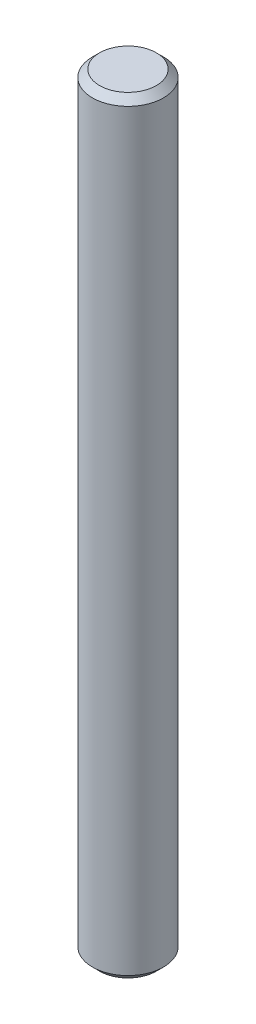
ISO-10303-21;
HEADER;
FILE_DESCRIPTION(('STEP AP214'),'2;1');
FILE_NAME('part.step','',(''),(''),'','','');
FILE_SCHEMA(('AUTOMOTIVE_DESIGN { 1 0 10303 214 1 1 1 1 }'));
ENDSEC;
DATA;
#1=APPLICATION_CONTEXT('core data for automotive mechanical design processes');
#2=APPLICATION_PROTOCOL_DEFINITION('international standard','automotive_design',2000,#1);
#3=PRODUCT_CONTEXT('',#1,'mechanical');
#4=PRODUCT('Part','Part','',(#3));
#5=PRODUCT_RELATED_PRODUCT_CATEGORY('part','',(#4));
#6=PRODUCT_DEFINITION_FORMATION('','',#4);
#7=PRODUCT_DEFINITION_CONTEXT('part definition',#1,'design');
#8=PRODUCT_DEFINITION('design','',#6,#7);
#9=PRODUCT_DEFINITION_SHAPE('','',#8);
#10=(LENGTH_UNIT() NAMED_UNIT(*) SI_UNIT(.MILLI.,.METRE.));
#11=(NAMED_UNIT(*) PLANE_ANGLE_UNIT() SI_UNIT($,.RADIAN.));
#12=(NAMED_UNIT(*) SI_UNIT($,.STERADIAN.) SOLID_ANGLE_UNIT());
#13=UNCERTAINTY_MEASURE_WITH_UNIT(LENGTH_MEASURE(1.E-05),#10,'distance_accuracy_value','');
#14=(GEOMETRIC_REPRESENTATION_CONTEXT(3) GLOBAL_UNCERTAINTY_ASSIGNED_CONTEXT((#13)) GLOBAL_UNIT_ASSIGNED_CONTEXT((#10,
#11,#12)) REPRESENTATION_CONTEXT('',''));
#15=CARTESIAN_POINT('',(0.,0.,0.));
#16=DIRECTION('',(0.,0.,1.));
#17=DIRECTION('',(1.,0.,0.));
#18=AXIS2_PLACEMENT_3D('',#15,#16,#17);
#19=CARTESIAN_POINT('',(0.,54.,0.));
#20=DIRECTION('',(0.,-1.,0.));
#21=DIRECTION('',(1.,0.,0.));
#22=AXIS2_PLACEMENT_3D('',#19,#20,#21);
#23=PLANE('',#22);
#24=CARTESIAN_POINT('',(0.,54.,0.));
#25=DIRECTION('',(0.,-1.,0.));
#26=DIRECTION('',(1.,0.,0.));
#27=AXIS2_PLACEMENT_3D('',#24,#25,#26);
#28=CIRCLE('',#27,4.00000000000002);
#29=CARTESIAN_POINT('',(4.,54.,0.));
#30=VERTEX_POINT('',#29);
#31=EDGE_CURVE('E10',#30,#30,#28,.F.);
#32=ORIENTED_EDGE('',*,*,#31,.T.);
#33=EDGE_LOOP('',(#32));
#34=FACE_BOUND('',#33,.T.);
#35=ADVANCED_FACE('F35',(#34),#23,.F.);
#36=CARTESIAN_POINT('',(0.,54.,0.));
#37=DIRECTION('',(0.,1.,0.));
#38=DIRECTION('',(-1.,0.,0.));
#39=AXIS2_PLACEMENT_3D('',#36,#37,#38);
#40=CYLINDRICAL_SURFACE('',#39,5.00000000000001);
#41=CARTESIAN_POINT('',(0.,-53.,0.));
#42=DIRECTION('',(0.,1.,0.));
#43=DIRECTION('',(-1.,0.,0.));
#44=AXIS2_PLACEMENT_3D('',#41,#42,#43);
#45=CIRCLE('',#44,5.00000000000001);
#46=CARTESIAN_POINT('',(-5.,-53.,0.));
#47=VERTEX_POINT('',#46);
#48=EDGE_CURVE('E47',#47,#47,#45,.T.);
#49=ORIENTED_EDGE('',*,*,#48,.T.);
#50=EDGE_LOOP('',(#49));
#51=FACE_BOUND('',#50,.T.);
#52=CARTESIAN_POINT('',(0.,53.,0.));
#53=DIRECTION('',(0.,-1.,0.));
#54=DIRECTION('',(1.,0.,0.));
#55=AXIS2_PLACEMENT_3D('',#52,#53,#54);
#56=CIRCLE('',#55,5.00000000000001);
#57=CARTESIAN_POINT('',(4.99999999999999,53.,0.));
#58=VERTEX_POINT('',#57);
#59=EDGE_CURVE('E51',#58,#58,#56,.T.);
#60=ORIENTED_EDGE('',*,*,#59,.T.);
#61=EDGE_LOOP('',(#60));
#62=FACE_BOUND('',#61,.T.);
#63=ADVANCED_FACE('F57',(#51,#62),#40,.T.);
#64=CARTESIAN_POINT('',(5.00000000000001,-54.,0.));
#65=DIRECTION('',(0.,1.,0.));
#66=DIRECTION('',(-1.,0.,0.));
#67=AXIS2_PLACEMENT_3D('',#64,#65,#66);
#68=PLANE('',#67);
#69=CARTESIAN_POINT('',(0.,-54.,0.));
#70=DIRECTION('',(0.,1.,0.));
#71=DIRECTION('',(-1.,0.,0.));
#72=AXIS2_PLACEMENT_3D('',#69,#70,#71);
#73=CIRCLE('',#72,3.99999999999999);
#74=CARTESIAN_POINT('',(-3.99999999999998,-54.,0.));
#75=VERTEX_POINT('',#74);
#76=EDGE_CURVE('E43',#75,#75,#73,.F.);
#77=ORIENTED_EDGE('',*,*,#76,.T.);
#78=EDGE_LOOP('',(#77));
#79=FACE_BOUND('',#78,.T.);
#80=ADVANCED_FACE('F65',(#79),#68,.F.);
#81=CARTESIAN_POINT('',(0.,-53.,0.));
#82=DIRECTION('',(0.,1.,0.));
#83=DIRECTION('',(-1.,0.,0.));
#84=AXIS2_PLACEMENT_3D('',#81,#82,#83);
#85=CONICAL_SURFACE('',#84,5.00000000000001,0.78539816339745);
#86=ORIENTED_EDGE('',*,*,#76,.F.);
#87=EDGE_LOOP('',(#86));
#88=FACE_BOUND('',#87,.T.);
#89=ORIENTED_EDGE('',*,*,#48,.F.);
#90=EDGE_LOOP('',(#89));
#91=FACE_BOUND('',#90,.T.);
#92=ADVANCED_FACE('F61',(#88,#91),#85,.T.);
#93=CARTESIAN_POINT('',(0.,54.,0.));
#94=DIRECTION('',(0.,-1.,0.));
#95=DIRECTION('',(1.,0.,0.));
#96=AXIS2_PLACEMENT_3D('',#93,#94,#95);
#97=CONICAL_SURFACE('',#96,4.00000000000002,0.785398163397446);
#98=ORIENTED_EDGE('',*,*,#59,.F.);
#99=EDGE_LOOP('',(#98));
#100=FACE_BOUND('',#99,.T.);
#101=ORIENTED_EDGE('',*,*,#31,.F.);
#102=EDGE_LOOP('',(#101));
#103=FACE_BOUND('',#102,.T.);
#104=ADVANCED_FACE('F38',(#100,#103),#97,.T.);
#105=CLOSED_SHELL('',(#35,#63,#80,#92,#104));
#106=MANIFOLD_SOLID_BREP('B2',#105);
#107=ADVANCED_BREP_SHAPE_REPRESENTATION('',(#18,#106),#14);
#108=SHAPE_DEFINITION_REPRESENTATION(#9,#107);
ENDSEC;
END-ISO-10303-21;
